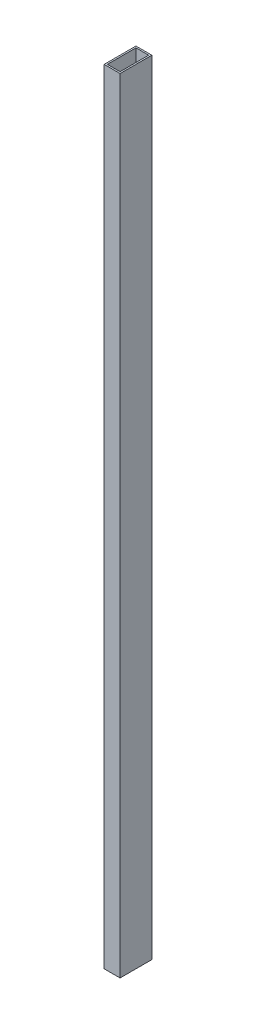
ISO-10303-21;
HEADER;
FILE_DESCRIPTION(('STEP AP214'),'2;1');
FILE_NAME('part.step','',(''),(''),'','','');
FILE_SCHEMA(('AUTOMOTIVE_DESIGN { 1 0 10303 214 1 1 1 1 }'));
ENDSEC;
DATA;
#1=APPLICATION_CONTEXT('core data for automotive mechanical design processes');
#2=APPLICATION_PROTOCOL_DEFINITION('international standard','automotive_design',2000,#1);
#3=PRODUCT_CONTEXT('',#1,'mechanical');
#4=PRODUCT('Part','Part','',(#3));
#5=PRODUCT_RELATED_PRODUCT_CATEGORY('part','',(#4));
#6=PRODUCT_DEFINITION_FORMATION('','',#4);
#7=PRODUCT_DEFINITION_CONTEXT('part definition',#1,'design');
#8=PRODUCT_DEFINITION('design','',#6,#7);
#9=PRODUCT_DEFINITION_SHAPE('','',#8);
#10=(LENGTH_UNIT() NAMED_UNIT(*) SI_UNIT(.MILLI.,.METRE.));
#11=(NAMED_UNIT(*) PLANE_ANGLE_UNIT() SI_UNIT($,.RADIAN.));
#12=(NAMED_UNIT(*) SI_UNIT($,.STERADIAN.) SOLID_ANGLE_UNIT());
#13=UNCERTAINTY_MEASURE_WITH_UNIT(LENGTH_MEASURE(1.E-05),#10,'distance_accuracy_value','');
#14=(GEOMETRIC_REPRESENTATION_CONTEXT(3) GLOBAL_UNCERTAINTY_ASSIGNED_CONTEXT((#13)) GLOBAL_UNIT_ASSIGNED_CONTEXT((#10,
#11,#12)) REPRESENTATION_CONTEXT('',''));
#15=CARTESIAN_POINT('',(0.,0.,0.));
#16=DIRECTION('',(0.,0.,1.));
#17=DIRECTION('',(1.,0.,0.));
#18=AXIS2_PLACEMENT_3D('',#15,#16,#17);
#19=CARTESIAN_POINT('',(20.,0.,0.));
#20=DIRECTION('',(0.,0.,1.));
#21=DIRECTION('',(1.,0.,0.));
#22=AXIS2_PLACEMENT_3D('',#19,#20,#21);
#23=PLANE('',#22);
#24=DIRECTION('',(0.,1.,0.));
#25=VECTOR('',#24,1.);
#26=CARTESIAN_POINT('',(0.,0.,0.));
#27=LINE('',#26,#25);
#28=CARTESIAN_POINT('',(0.,0.,0.));
#29=VERTEX_POINT('',#28);
#30=CARTESIAN_POINT('',(0.,985.51,0.));
#31=VERTEX_POINT('',#30);
#32=EDGE_CURVE('E126',#29,#31,#27,.T.);
#33=ORIENTED_EDGE('',*,*,#32,.T.);
#34=DIRECTION('',(-1.,0.,0.));
#35=VECTOR('',#34,1.);
#36=CARTESIAN_POINT('',(20.,985.51,0.));
#37=LINE('',#36,#35);
#38=CARTESIAN_POINT('',(20.,985.51,0.));
#39=VERTEX_POINT('',#38);
#40=EDGE_CURVE('E155',#39,#31,#37,.T.);
#41=ORIENTED_EDGE('',*,*,#40,.F.);
#42=DIRECTION('',(0.,1.,0.));
#43=VECTOR('',#42,1.);
#44=CARTESIAN_POINT('',(20.,0.,0.));
#45=LINE('',#44,#43);
#46=CARTESIAN_POINT('',(20.,0.,0.));
#47=VERTEX_POINT('',#46);
#48=EDGE_CURVE('E129',#47,#39,#45,.T.);
#49=ORIENTED_EDGE('',*,*,#48,.F.);
#50=DIRECTION('',(-1.,0.,0.));
#51=VECTOR('',#50,1.);
#52=CARTESIAN_POINT('',(20.,0.,0.));
#53=LINE('',#52,#51);
#54=EDGE_CURVE('E139',#47,#29,#53,.T.);
#55=ORIENTED_EDGE('',*,*,#54,.T.);
#56=EDGE_LOOP('',(#33,#41,#49,#55));
#57=FACE_BOUND('',#56,.T.);
#58=ADVANCED_FACE('F36',(#57),#23,.F.);
#59=CARTESIAN_POINT('',(20.,985.51,0.));
#60=DIRECTION('',(0.,-1.,0.));
#61=DIRECTION('',(0.,0.,-1.));
#62=AXIS2_PLACEMENT_3D('',#59,#60,#61);
#63=PLANE('',#62);
#64=DIRECTION('',(-1.,0.,0.));
#65=VECTOR('',#64,1.);
#66=CARTESIAN_POINT('',(2.,985.51,2.));
#67=LINE('',#66,#65);
#68=CARTESIAN_POINT('',(18.,985.51,2.));
#69=VERTEX_POINT('',#68);
#70=CARTESIAN_POINT('',(2.,985.51,2.));
#71=VERTEX_POINT('',#70);
#72=EDGE_CURVE('E112',#69,#71,#67,.T.);
#73=ORIENTED_EDGE('',*,*,#72,.F.);
#74=DIRECTION('',(0.,0.,-1.));
#75=VECTOR('',#74,1.);
#76=CARTESIAN_POINT('',(18.,985.51,2.));
#77=LINE('',#76,#75);
#78=CARTESIAN_POINT('',(18.,985.51,38.));
#79=VERTEX_POINT('',#78);
#80=EDGE_CURVE('E50',#79,#69,#77,.T.);
#81=ORIENTED_EDGE('',*,*,#80,.F.);
#82=DIRECTION('',(1.,0.,0.));
#83=VECTOR('',#82,1.);
#84=CARTESIAN_POINT('',(2.,985.51,38.));
#85=LINE('',#84,#83);
#86=CARTESIAN_POINT('',(2.,985.51,38.));
#87=VERTEX_POINT('',#86);
#88=EDGE_CURVE('E119',#87,#79,#85,.T.);
#89=ORIENTED_EDGE('',*,*,#88,.F.);
#90=DIRECTION('',(0.,0.,1.));
#91=VECTOR('',#90,1.);
#92=CARTESIAN_POINT('',(2.,985.51,2.));
#93=LINE('',#92,#91);
#94=EDGE_CURVE('E103',#71,#87,#93,.T.);
#95=ORIENTED_EDGE('',*,*,#94,.F.);
#96=EDGE_LOOP('',(#73,#81,#89,#95));
#97=FACE_BOUND('',#96,.T.);
#98=DIRECTION('',(0.,0.,1.));
#99=VECTOR('',#98,1.);
#100=CARTESIAN_POINT('',(0.,985.51,0.));
#101=LINE('',#100,#99);
#102=CARTESIAN_POINT('',(0.,985.51,40.));
#103=VERTEX_POINT('',#102);
#104=EDGE_CURVE('E142',#31,#103,#101,.T.);
#105=ORIENTED_EDGE('',*,*,#104,.T.);
#106=DIRECTION('',(-1.,0.,0.));
#107=VECTOR('',#106,1.);
#108=CARTESIAN_POINT('',(20.,985.51,40.));
#109=LINE('',#108,#107);
#110=CARTESIAN_POINT('',(20.,985.51,40.));
#111=VERTEX_POINT('',#110);
#112=EDGE_CURVE('E152',#111,#103,#109,.T.);
#113=ORIENTED_EDGE('',*,*,#112,.F.);
#114=DIRECTION('',(0.,0.,1.));
#115=VECTOR('',#114,1.);
#116=CARTESIAN_POINT('',(20.,985.51,0.));
#117=LINE('',#116,#115);
#118=EDGE_CURVE('E132',#39,#111,#117,.T.);
#119=ORIENTED_EDGE('',*,*,#118,.F.);
#120=ORIENTED_EDGE('',*,*,#40,.T.);
#121=EDGE_LOOP('',(#105,#113,#119,#120));
#122=FACE_BOUND('',#121,.T.);
#123=ADVANCED_FACE('F116',(#97,#122),#63,.F.);
#124=CARTESIAN_POINT('',(20.,0.,40.));
#125=DIRECTION('',(0.,0.,-1.));
#126=DIRECTION('',(-1.,0.,0.));
#127=AXIS2_PLACEMENT_3D('',#124,#125,#126);
#128=PLANE('',#127);
#129=DIRECTION('',(0.,-1.,0.));
#130=VECTOR('',#129,1.);
#131=CARTESIAN_POINT('',(0.,0.,40.));
#132=LINE('',#131,#130);
#133=CARTESIAN_POINT('',(0.,0.,40.));
#134=VERTEX_POINT('',#133);
#135=EDGE_CURVE('E144',#103,#134,#132,.T.);
#136=ORIENTED_EDGE('',*,*,#135,.T.);
#137=DIRECTION('',(-1.,0.,0.));
#138=VECTOR('',#137,1.);
#139=CARTESIAN_POINT('',(20.,0.,40.));
#140=LINE('',#139,#138);
#141=CARTESIAN_POINT('',(20.,0.,40.));
#142=VERTEX_POINT('',#141);
#143=EDGE_CURVE('E149',#142,#134,#140,.T.);
#144=ORIENTED_EDGE('',*,*,#143,.F.);
#145=DIRECTION('',(0.,-1.,0.));
#146=VECTOR('',#145,1.);
#147=CARTESIAN_POINT('',(20.,0.,40.));
#148=LINE('',#147,#146);
#149=EDGE_CURVE('E135',#111,#142,#148,.T.);
#150=ORIENTED_EDGE('',*,*,#149,.F.);
#151=ORIENTED_EDGE('',*,*,#112,.T.);
#152=EDGE_LOOP('',(#136,#144,#150,#151));
#153=FACE_BOUND('',#152,.T.);
#154=ADVANCED_FACE('F186',(#153),#128,.F.);
#155=CARTESIAN_POINT('',(20.,0.,0.));
#156=DIRECTION('',(0.,1.,0.));
#157=DIRECTION('',(0.,0.,1.));
#158=AXIS2_PLACEMENT_3D('',#155,#156,#157);
#159=PLANE('',#158);
#160=DIRECTION('',(1.,0.,0.));
#161=VECTOR('',#160,1.);
#162=CARTESIAN_POINT('',(20.,0.,38.));
#163=LINE('',#162,#161);
#164=CARTESIAN_POINT('',(2.,0.,38.));
#165=VERTEX_POINT('',#164);
#166=CARTESIAN_POINT('',(18.,0.,38.));
#167=VERTEX_POINT('',#166);
#168=EDGE_CURVE('E43',#165,#167,#163,.T.);
#169=ORIENTED_EDGE('',*,*,#168,.T.);
#170=DIRECTION('',(0.,0.,-1.));
#171=VECTOR('',#170,1.);
#172=CARTESIAN_POINT('',(18.,0.,0.));
#173=LINE('',#172,#171);
#174=CARTESIAN_POINT('',(18.,0.,2.));
#175=VERTEX_POINT('',#174);
#176=EDGE_CURVE('E11',#167,#175,#173,.T.);
#177=ORIENTED_EDGE('',*,*,#176,.T.);
#178=DIRECTION('',(-1.,0.,0.));
#179=VECTOR('',#178,1.);
#180=CARTESIAN_POINT('',(20.,0.,2.));
#181=LINE('',#180,#179);
#182=CARTESIAN_POINT('',(2.,0.,2.));
#183=VERTEX_POINT('',#182);
#184=EDGE_CURVE('E158',#175,#183,#181,.T.);
#185=ORIENTED_EDGE('',*,*,#184,.T.);
#186=DIRECTION('',(0.,0.,1.));
#187=VECTOR('',#186,1.);
#188=CARTESIAN_POINT('',(2.,0.,0.));
#189=LINE('',#188,#187);
#190=EDGE_CURVE('E106',#183,#165,#189,.T.);
#191=ORIENTED_EDGE('',*,*,#190,.T.);
#192=EDGE_LOOP('',(#169,#177,#185,#191));
#193=FACE_BOUND('',#192,.T.);
#194=DIRECTION('',(0.,0.,-1.));
#195=VECTOR('',#194,1.);
#196=CARTESIAN_POINT('',(0.,0.,0.));
#197=LINE('',#196,#195);
#198=EDGE_CURVE('E133',#134,#29,#197,.T.);
#199=ORIENTED_EDGE('',*,*,#198,.T.);
#200=ORIENTED_EDGE('',*,*,#54,.F.);
#201=DIRECTION('',(0.,0.,-1.));
#202=VECTOR('',#201,1.);
#203=CARTESIAN_POINT('',(20.,0.,0.));
#204=LINE('',#203,#202);
#205=EDGE_CURVE('E137',#142,#47,#204,.T.);
#206=ORIENTED_EDGE('',*,*,#205,.F.);
#207=ORIENTED_EDGE('',*,*,#143,.T.);
#208=EDGE_LOOP('',(#199,#200,#206,#207));
#209=FACE_BOUND('',#208,.T.);
#210=ADVANCED_FACE('F162',(#193,#209),#159,.F.);
#211=CARTESIAN_POINT('',(20.,0.,0.));
#212=DIRECTION('',(1.,0.,0.));
#213=DIRECTION('',(0.,0.,-1.));
#214=AXIS2_PLACEMENT_3D('',#211,#212,#213);
#215=PLANE('',#214);
#216=ORIENTED_EDGE('',*,*,#48,.T.);
#217=ORIENTED_EDGE('',*,*,#118,.T.);
#218=ORIENTED_EDGE('',*,*,#149,.T.);
#219=ORIENTED_EDGE('',*,*,#205,.T.);
#220=EDGE_LOOP('',(#216,#217,#218,#219));
#221=FACE_BOUND('',#220,.T.);
#222=ADVANCED_FACE('F176',(#221),#215,.T.);
#223=CARTESIAN_POINT('',(0.,0.,0.));
#224=DIRECTION('',(1.,0.,0.));
#225=DIRECTION('',(0.,0.,-1.));
#226=AXIS2_PLACEMENT_3D('',#223,#224,#225);
#227=PLANE('',#226);
#228=ORIENTED_EDGE('',*,*,#32,.F.);
#229=ORIENTED_EDGE('',*,*,#198,.F.);
#230=ORIENTED_EDGE('',*,*,#135,.F.);
#231=ORIENTED_EDGE('',*,*,#104,.F.);
#232=EDGE_LOOP('',(#228,#229,#230,#231));
#233=FACE_BOUND('',#232,.T.);
#234=ADVANCED_FACE('F169',(#233),#227,.F.);
#235=CARTESIAN_POINT('',(18.,-14.49,2.));
#236=DIRECTION('',(1.,0.,0.));
#237=DIRECTION('',(0.,0.,-1.));
#238=AXIS2_PLACEMENT_3D('',#235,#236,#237);
#239=PLANE('',#238);
#240=DIRECTION('',(0.,1.,0.));
#241=VECTOR('',#240,1.);
#242=CARTESIAN_POINT('',(18.,-14.49,38.));
#243=LINE('',#242,#241);
#244=EDGE_CURVE('E124',#167,#79,#243,.T.);
#245=ORIENTED_EDGE('',*,*,#244,.T.);
#246=ORIENTED_EDGE('',*,*,#80,.T.);
#247=DIRECTION('',(0.,1.,0.));
#248=VECTOR('',#247,1.);
#249=CARTESIAN_POINT('',(18.,-14.49,2.));
#250=LINE('',#249,#248);
#251=EDGE_CURVE('E109',#175,#69,#250,.T.);
#252=ORIENTED_EDGE('',*,*,#251,.F.);
#253=ORIENTED_EDGE('',*,*,#176,.F.);
#254=EDGE_LOOP('',(#245,#246,#252,#253));
#255=FACE_BOUND('',#254,.T.);
#256=ADVANCED_FACE('F167',(#255),#239,.F.);
#257=CARTESIAN_POINT('',(2.,-14.49,38.));
#258=DIRECTION('',(0.,0.,1.));
#259=DIRECTION('',(1.,0.,0.));
#260=AXIS2_PLACEMENT_3D('',#257,#258,#259);
#261=PLANE('',#260);
#262=DIRECTION('',(0.,1.,0.));
#263=VECTOR('',#262,1.);
#264=CARTESIAN_POINT('',(2.,-14.49,38.));
#265=LINE('',#264,#263);
#266=EDGE_CURVE('E108',#165,#87,#265,.T.);
#267=ORIENTED_EDGE('',*,*,#266,.T.);
#268=ORIENTED_EDGE('',*,*,#88,.T.);
#269=ORIENTED_EDGE('',*,*,#244,.F.);
#270=ORIENTED_EDGE('',*,*,#168,.F.);
#271=EDGE_LOOP('',(#267,#268,#269,#270));
#272=FACE_BOUND('',#271,.T.);
#273=ADVANCED_FACE('F166',(#272),#261,.F.);
#274=CARTESIAN_POINT('',(2.,-14.49,2.));
#275=DIRECTION('',(-1.,0.,0.));
#276=DIRECTION('',(0.,0.,1.));
#277=AXIS2_PLACEMENT_3D('',#274,#275,#276);
#278=PLANE('',#277);
#279=DIRECTION('',(0.,1.,0.));
#280=VECTOR('',#279,1.);
#281=CARTESIAN_POINT('',(2.,-14.49,2.));
#282=LINE('',#281,#280);
#283=EDGE_CURVE('E58',#183,#71,#282,.T.);
#284=ORIENTED_EDGE('',*,*,#283,.T.);
#285=ORIENTED_EDGE('',*,*,#94,.T.);
#286=ORIENTED_EDGE('',*,*,#266,.F.);
#287=ORIENTED_EDGE('',*,*,#190,.F.);
#288=EDGE_LOOP('',(#284,#285,#286,#287));
#289=FACE_BOUND('',#288,.T.);
#290=ADVANCED_FACE('F100',(#289),#278,.F.);
#291=CARTESIAN_POINT('',(2.,-14.49,2.));
#292=DIRECTION('',(0.,0.,-1.));
#293=DIRECTION('',(-1.,0.,0.));
#294=AXIS2_PLACEMENT_3D('',#291,#292,#293);
#295=PLANE('',#294);
#296=ORIENTED_EDGE('',*,*,#251,.T.);
#297=ORIENTED_EDGE('',*,*,#72,.T.);
#298=ORIENTED_EDGE('',*,*,#283,.F.);
#299=ORIENTED_EDGE('',*,*,#184,.F.);
#300=EDGE_LOOP('',(#296,#297,#298,#299));
#301=FACE_BOUND('',#300,.T.);
#302=ADVANCED_FACE('F113',(#301),#295,.F.);
#303=CLOSED_SHELL('',(#58,#123,#154,#210,#222,#234,#256,#273,#290,#302));
#304=MANIFOLD_SOLID_BREP('B2',#303);
#305=ADVANCED_BREP_SHAPE_REPRESENTATION('',(#18,#304),#14);
#306=SHAPE_DEFINITION_REPRESENTATION(#9,#305);
ENDSEC;
END-ISO-10303-21;
